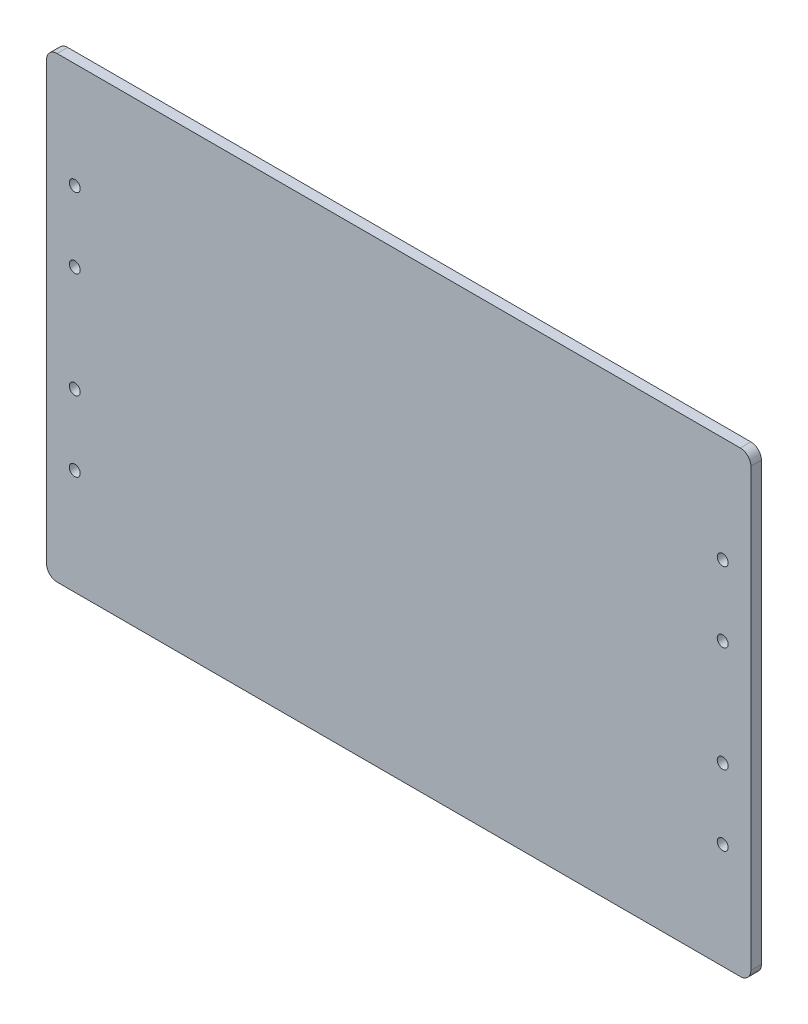
ISO-10303-21;
HEADER;
FILE_DESCRIPTION(('STEP AP214'),'2;1');
FILE_NAME('part.step','',(''),(''),'','','');
FILE_SCHEMA(('AUTOMOTIVE_DESIGN { 1 0 10303 214 1 1 1 1 }'));
ENDSEC;
DATA;
#1=APPLICATION_CONTEXT('core data for automotive mechanical design processes');
#2=APPLICATION_PROTOCOL_DEFINITION('international standard','automotive_design',2000,#1);
#3=PRODUCT_CONTEXT('',#1,'mechanical');
#4=PRODUCT('Part','Part','',(#3));
#5=PRODUCT_RELATED_PRODUCT_CATEGORY('part','',(#4));
#6=PRODUCT_DEFINITION_FORMATION('','',#4);
#7=PRODUCT_DEFINITION_CONTEXT('part definition',#1,'design');
#8=PRODUCT_DEFINITION('design','',#6,#7);
#9=PRODUCT_DEFINITION_SHAPE('','',#8);
#10=(LENGTH_UNIT() NAMED_UNIT(*) SI_UNIT(.MILLI.,.METRE.));
#11=(NAMED_UNIT(*) PLANE_ANGLE_UNIT() SI_UNIT($,.RADIAN.));
#12=(NAMED_UNIT(*) SI_UNIT($,.STERADIAN.) SOLID_ANGLE_UNIT());
#13=UNCERTAINTY_MEASURE_WITH_UNIT(LENGTH_MEASURE(1.E-05),#10,'distance_accuracy_value','');
#14=(GEOMETRIC_REPRESENTATION_CONTEXT(3) GLOBAL_UNCERTAINTY_ASSIGNED_CONTEXT((#13)) GLOBAL_UNIT_ASSIGNED_CONTEXT((#10,
#11,#12)) REPRESENTATION_CONTEXT('',''));
#15=CARTESIAN_POINT('',(0.,0.,0.));
#16=DIRECTION('',(0.,0.,1.));
#17=DIRECTION('',(1.,0.,0.));
#18=AXIS2_PLACEMENT_3D('',#15,#16,#17);
#19=CARTESIAN_POINT('',(100.,65.,3.));
#20=DIRECTION('',(-1.,0.,0.));
#21=DIRECTION('',(0.,-1.,0.));
#22=AXIS2_PLACEMENT_3D('',#19,#20,#21);
#23=PLANE('',#22);
#24=DIRECTION('',(0.,1.,0.));
#25=VECTOR('',#24,1.);
#26=CARTESIAN_POINT('',(100.,65.,3.));
#27=LINE('',#26,#25);
#28=CARTESIAN_POINT('',(100.,-62.,3.));
#29=VERTEX_POINT('',#28);
#30=CARTESIAN_POINT('',(100.,62.,3.));
#31=VERTEX_POINT('',#30);
#32=EDGE_CURVE('E127',#29,#31,#27,.T.);
#33=ORIENTED_EDGE('',*,*,#32,.F.);
#34=DIRECTION('',(0.,0.,-1.));
#35=VECTOR('',#34,1.);
#36=CARTESIAN_POINT('',(100.,-62.,3.));
#37=LINE('',#36,#35);
#38=CARTESIAN_POINT('',(100.,-62.,0.));
#39=VERTEX_POINT('',#38);
#40=EDGE_CURVE('E153',#29,#39,#37,.T.);
#41=ORIENTED_EDGE('',*,*,#40,.T.);
#42=DIRECTION('',(0.,1.,0.));
#43=VECTOR('',#42,1.);
#44=CARTESIAN_POINT('',(100.,65.,0.));
#45=LINE('',#44,#43);
#46=CARTESIAN_POINT('',(100.,62.,0.));
#47=VERTEX_POINT('',#46);
#48=EDGE_CURVE('E159',#39,#47,#45,.T.);
#49=ORIENTED_EDGE('',*,*,#48,.T.);
#50=DIRECTION('',(0.,0.,-1.));
#51=VECTOR('',#50,1.);
#52=CARTESIAN_POINT('',(100.,62.,3.));
#53=LINE('',#52,#51);
#54=EDGE_CURVE('E151',#47,#31,#53,.F.);
#55=ORIENTED_EDGE('',*,*,#54,.T.);
#56=EDGE_LOOP('',(#33,#41,#49,#55));
#57=FACE_BOUND('',#56,.T.);
#58=ADVANCED_FACE('F35',(#57),#23,.F.);
#59=CARTESIAN_POINT('',(-100.,65.,3.));
#60=DIRECTION('',(0.,-1.,0.));
#61=DIRECTION('',(0.,0.,-1.));
#62=AXIS2_PLACEMENT_3D('',#59,#60,#61);
#63=PLANE('',#62);
#64=DIRECTION('',(-1.,0.,0.));
#65=VECTOR('',#64,1.);
#66=CARTESIAN_POINT('',(-100.,65.,3.));
#67=LINE('',#66,#65);
#68=CARTESIAN_POINT('',(97.,65.,3.));
#69=VERTEX_POINT('',#68);
#70=CARTESIAN_POINT('',(-97.,65.,3.));
#71=VERTEX_POINT('',#70);
#72=EDGE_CURVE('E130',#69,#71,#67,.T.);
#73=ORIENTED_EDGE('',*,*,#72,.F.);
#74=DIRECTION('',(0.,0.,-1.));
#75=VECTOR('',#74,1.);
#76=CARTESIAN_POINT('',(97.,65.,3.));
#77=LINE('',#76,#75);
#78=CARTESIAN_POINT('',(97.,65.,0.));
#79=VERTEX_POINT('',#78);
#80=EDGE_CURVE('E11',#69,#79,#77,.T.);
#81=ORIENTED_EDGE('',*,*,#80,.T.);
#82=DIRECTION('',(-1.,0.,0.));
#83=VECTOR('',#82,1.);
#84=CARTESIAN_POINT('',(-100.,65.,0.));
#85=LINE('',#84,#83);
#86=CARTESIAN_POINT('',(-97.,65.,0.));
#87=VERTEX_POINT('',#86);
#88=EDGE_CURVE('E132',#79,#87,#85,.T.);
#89=ORIENTED_EDGE('',*,*,#88,.T.);
#90=DIRECTION('',(0.,0.,-1.));
#91=VECTOR('',#90,1.);
#92=CARTESIAN_POINT('',(-97.,65.,3.));
#93=LINE('',#92,#91);
#94=EDGE_CURVE('E43',#87,#71,#93,.F.);
#95=ORIENTED_EDGE('',*,*,#94,.T.);
#96=EDGE_LOOP('',(#73,#81,#89,#95));
#97=FACE_BOUND('',#96,.T.);
#98=ADVANCED_FACE('F257',(#97),#63,.F.);
#99=CARTESIAN_POINT('',(-100.,65.,3.));
#100=DIRECTION('',(1.,0.,0.));
#101=DIRECTION('',(0.,1.,0.));
#102=AXIS2_PLACEMENT_3D('',#99,#100,#101);
#103=PLANE('',#102);
#104=DIRECTION('',(0.,-1.,0.));
#105=VECTOR('',#104,1.);
#106=CARTESIAN_POINT('',(-100.,65.,0.));
#107=LINE('',#106,#105);
#108=CARTESIAN_POINT('',(-100.,62.,0.));
#109=VERTEX_POINT('',#108);
#110=CARTESIAN_POINT('',(-100.,-62.,0.));
#111=VERTEX_POINT('',#110);
#112=EDGE_CURVE('E128',#109,#111,#107,.T.);
#113=ORIENTED_EDGE('',*,*,#112,.T.);
#114=DIRECTION('',(0.,0.,-1.));
#115=VECTOR('',#114,1.);
#116=CARTESIAN_POINT('',(-100.,-62.,3.));
#117=LINE('',#116,#115);
#118=CARTESIAN_POINT('',(-100.,-62.,3.));
#119=VERTEX_POINT('',#118);
#120=EDGE_CURVE('E106',#111,#119,#117,.F.);
#121=ORIENTED_EDGE('',*,*,#120,.T.);
#122=DIRECTION('',(0.,-1.,0.));
#123=VECTOR('',#122,1.);
#124=CARTESIAN_POINT('',(-100.,65.,3.));
#125=LINE('',#124,#123);
#126=CARTESIAN_POINT('',(-100.,62.,3.));
#127=VERTEX_POINT('',#126);
#128=EDGE_CURVE('E171',#127,#119,#125,.T.);
#129=ORIENTED_EDGE('',*,*,#128,.F.);
#130=DIRECTION('',(0.,0.,-1.));
#131=VECTOR('',#130,1.);
#132=CARTESIAN_POINT('',(-100.,62.,3.));
#133=LINE('',#132,#131);
#134=EDGE_CURVE('E111',#127,#109,#133,.T.);
#135=ORIENTED_EDGE('',*,*,#134,.T.);
#136=EDGE_LOOP('',(#113,#121,#129,#135));
#137=FACE_BOUND('',#136,.T.);
#138=ADVANCED_FACE('F255',(#137),#103,.F.);
#139=CARTESIAN_POINT('',(-100.,-65.,3.));
#140=DIRECTION('',(0.,1.,0.));
#141=DIRECTION('',(0.,0.,1.));
#142=AXIS2_PLACEMENT_3D('',#139,#140,#141);
#143=PLANE('',#142);
#144=DIRECTION('',(1.,0.,0.));
#145=VECTOR('',#144,1.);
#146=CARTESIAN_POINT('',(-100.,-65.,3.));
#147=LINE('',#146,#145);
#148=CARTESIAN_POINT('',(-97.,-65.,3.));
#149=VERTEX_POINT('',#148);
#150=CARTESIAN_POINT('',(97.,-65.,3.));
#151=VERTEX_POINT('',#150);
#152=EDGE_CURVE('E121',#149,#151,#147,.T.);
#153=ORIENTED_EDGE('',*,*,#152,.F.);
#154=DIRECTION('',(0.,0.,-1.));
#155=VECTOR('',#154,1.);
#156=CARTESIAN_POINT('',(-97.,-65.,3.));
#157=LINE('',#156,#155);
#158=CARTESIAN_POINT('',(-97.,-65.,0.));
#159=VERTEX_POINT('',#158);
#160=EDGE_CURVE('E105',#149,#159,#157,.T.);
#161=ORIENTED_EDGE('',*,*,#160,.T.);
#162=DIRECTION('',(1.,0.,0.));
#163=VECTOR('',#162,1.);
#164=CARTESIAN_POINT('',(-100.,-65.,0.));
#165=LINE('',#164,#163);
#166=CARTESIAN_POINT('',(97.,-65.,0.));
#167=VERTEX_POINT('',#166);
#168=EDGE_CURVE('E118',#159,#167,#165,.T.);
#169=ORIENTED_EDGE('',*,*,#168,.T.);
#170=DIRECTION('',(0.,0.,-1.));
#171=VECTOR('',#170,1.);
#172=CARTESIAN_POINT('',(97.,-65.,3.));
#173=LINE('',#172,#171);
#174=EDGE_CURVE('E123',#167,#151,#173,.F.);
#175=ORIENTED_EDGE('',*,*,#174,.T.);
#176=EDGE_LOOP('',(#153,#161,#169,#175));
#177=FACE_BOUND('',#176,.T.);
#178=ADVANCED_FACE('F117',(#177),#143,.F.);
#179=CARTESIAN_POINT('',(0.,0.,3.));
#180=DIRECTION('',(0.,0.,1.));
#181=DIRECTION('',(1.,0.,0.));
#182=AXIS2_PLACEMENT_3D('',#179,#180,#181);
#183=PLANE('',#182);
#184=CARTESIAN_POINT('',(92.,35.,3.));
#185=DIRECTION('',(0.,0.,-1.));
#186=DIRECTION('',(-1.,0.,0.));
#187=AXIS2_PLACEMENT_3D('',#184,#185,#186);
#188=CIRCLE('',#187,1.54999999999999);
#189=CARTESIAN_POINT('',(90.45,35.,3.));
#190=VERTEX_POINT('',#189);
#191=EDGE_CURVE('E214',#190,#190,#188,.T.);
#192=ORIENTED_EDGE('',*,*,#191,.T.);
#193=EDGE_LOOP('',(#192));
#194=FACE_BOUND('',#193,.T.);
#195=CARTESIAN_POINT('',(92.,-15.,3.));
#196=DIRECTION('',(0.,0.,-1.));
#197=DIRECTION('',(1.,0.,0.));
#198=AXIS2_PLACEMENT_3D('',#195,#196,#197);
#199=CIRCLE('',#198,1.54999999999999);
#200=CARTESIAN_POINT('',(93.55,-15.,3.));
#201=VERTEX_POINT('',#200);
#202=EDGE_CURVE('E208',#201,#201,#199,.T.);
#203=ORIENTED_EDGE('',*,*,#202,.T.);
#204=EDGE_LOOP('',(#203));
#205=FACE_BOUND('',#204,.T.);
#206=CARTESIAN_POINT('',(92.,-35.,3.));
#207=DIRECTION('',(0.,0.,-1.));
#208=DIRECTION('',(1.,0.,0.));
#209=AXIS2_PLACEMENT_3D('',#206,#207,#208);
#210=CIRCLE('',#209,1.55000000000005);
#211=CARTESIAN_POINT('',(93.5500000000001,-35.,3.));
#212=VERTEX_POINT('',#211);
#213=EDGE_CURVE('E202',#212,#212,#210,.T.);
#214=ORIENTED_EDGE('',*,*,#213,.T.);
#215=EDGE_LOOP('',(#214));
#216=FACE_BOUND('',#215,.T.);
#217=CARTESIAN_POINT('',(92.,15.,3.));
#218=DIRECTION('',(0.,0.,-1.));
#219=DIRECTION('',(-1.,0.,0.));
#220=AXIS2_PLACEMENT_3D('',#217,#218,#219);
#221=CIRCLE('',#220,1.54999999999999);
#222=CARTESIAN_POINT('',(90.45,15.,3.));
#223=VERTEX_POINT('',#222);
#224=EDGE_CURVE('E196',#223,#223,#221,.T.);
#225=ORIENTED_EDGE('',*,*,#224,.T.);
#226=EDGE_LOOP('',(#225));
#227=FACE_BOUND('',#226,.T.);
#228=CARTESIAN_POINT('',(-92.,35.,3.));
#229=DIRECTION('',(0.,0.,1.));
#230=DIRECTION('',(1.,0.,0.));
#231=AXIS2_PLACEMENT_3D('',#228,#229,#230);
#232=CIRCLE('',#231,1.54999999999999);
#233=CARTESIAN_POINT('',(-90.45,35.,3.));
#234=VERTEX_POINT('',#233);
#235=EDGE_CURVE('E167',#234,#234,#232,.T.);
#236=ORIENTED_EDGE('',*,*,#235,.F.);
#237=EDGE_LOOP('',(#236));
#238=FACE_BOUND('',#237,.T.);
#239=CARTESIAN_POINT('',(-92.,-15.,3.));
#240=DIRECTION('',(0.,0.,1.));
#241=DIRECTION('',(-1.,0.,0.));
#242=AXIS2_PLACEMENT_3D('',#239,#240,#241);
#243=CIRCLE('',#242,1.54999999999999);
#244=CARTESIAN_POINT('',(-93.55,-15.,3.));
#245=VERTEX_POINT('',#244);
#246=EDGE_CURVE('E188',#245,#245,#243,.T.);
#247=ORIENTED_EDGE('',*,*,#246,.F.);
#248=EDGE_LOOP('',(#247));
#249=FACE_BOUND('',#248,.T.);
#250=CARTESIAN_POINT('',(-92.,-35.,3.));
#251=DIRECTION('',(0.,0.,1.));
#252=DIRECTION('',(-1.,0.,0.));
#253=AXIS2_PLACEMENT_3D('',#250,#251,#252);
#254=CIRCLE('',#253,1.55000000000005);
#255=CARTESIAN_POINT('',(-93.5500000000001,-35.,3.));
#256=VERTEX_POINT('',#255);
#257=EDGE_CURVE('E182',#256,#256,#254,.T.);
#258=ORIENTED_EDGE('',*,*,#257,.F.);
#259=EDGE_LOOP('',(#258));
#260=FACE_BOUND('',#259,.T.);
#261=CARTESIAN_POINT('',(-92.,15.,3.));
#262=DIRECTION('',(0.,0.,1.));
#263=DIRECTION('',(1.,0.,0.));
#264=AXIS2_PLACEMENT_3D('',#261,#262,#263);
#265=CIRCLE('',#264,1.54999999999999);
#266=CARTESIAN_POINT('',(-90.45,15.,3.));
#267=VERTEX_POINT('',#266);
#268=EDGE_CURVE('E175',#267,#267,#265,.T.);
#269=ORIENTED_EDGE('',*,*,#268,.F.);
#270=EDGE_LOOP('',(#269));
#271=FACE_BOUND('',#270,.T.);
#272=ORIENTED_EDGE('',*,*,#128,.T.);
#273=CARTESIAN_POINT('',(-97.,-62.,3.));
#274=DIRECTION('',(0.,0.,1.));
#275=DIRECTION('',(1.,0.,0.));
#276=AXIS2_PLACEMENT_3D('',#273,#274,#275);
#277=CIRCLE('',#276,3.);
#278=EDGE_CURVE('E149',#119,#149,#277,.T.);
#279=ORIENTED_EDGE('',*,*,#278,.T.);
#280=ORIENTED_EDGE('',*,*,#152,.T.);
#281=CARTESIAN_POINT('',(97.,-62.,3.));
#282=DIRECTION('',(0.,0.,1.));
#283=DIRECTION('',(1.,0.,0.));
#284=AXIS2_PLACEMENT_3D('',#281,#282,#283);
#285=CIRCLE('',#284,3.);
#286=EDGE_CURVE('E147',#151,#29,#285,.T.);
#287=ORIENTED_EDGE('',*,*,#286,.T.);
#288=ORIENTED_EDGE('',*,*,#32,.T.);
#289=CARTESIAN_POINT('',(97.,62.,3.));
#290=DIRECTION('',(0.,0.,1.));
#291=DIRECTION('',(1.,0.,0.));
#292=AXIS2_PLACEMENT_3D('',#289,#290,#291);
#293=CIRCLE('',#292,3.);
#294=EDGE_CURVE('E56',#31,#69,#293,.T.);
#295=ORIENTED_EDGE('',*,*,#294,.T.);
#296=ORIENTED_EDGE('',*,*,#72,.T.);
#297=CARTESIAN_POINT('',(-97.,62.,3.));
#298=DIRECTION('',(0.,0.,1.));
#299=DIRECTION('',(1.,0.,0.));
#300=AXIS2_PLACEMENT_3D('',#297,#298,#299);
#301=CIRCLE('',#300,3.);
#302=EDGE_CURVE('E144',#71,#127,#301,.T.);
#303=ORIENTED_EDGE('',*,*,#302,.T.);
#304=EDGE_LOOP('',(#272,#279,#280,#287,#288,#295,#296,#303));
#305=FACE_BOUND('',#304,.T.);
#306=ADVANCED_FACE('F226',(#194,#205,#216,#227,#238,#249,#260,#271,#305),#183,.T.);
#307=CARTESIAN_POINT('',(0.,0.,0.));
#308=DIRECTION('',(0.,0.,1.));
#309=DIRECTION('',(1.,0.,0.));
#310=AXIS2_PLACEMENT_3D('',#307,#308,#309);
#311=PLANE('',#310);
#312=CARTESIAN_POINT('',(92.,35.,0.));
#313=DIRECTION('',(0.,0.,-1.));
#314=DIRECTION('',(-1.,0.,0.));
#315=AXIS2_PLACEMENT_3D('',#312,#313,#314);
#316=CIRCLE('',#315,1.54999999999999);
#317=CARTESIAN_POINT('',(90.45,35.,0.));
#318=VERTEX_POINT('',#317);
#319=EDGE_CURVE('E179',#318,#318,#316,.T.);
#320=ORIENTED_EDGE('',*,*,#319,.F.);
#321=EDGE_LOOP('',(#320));
#322=FACE_BOUND('',#321,.T.);
#323=CARTESIAN_POINT('',(92.,-15.,0.));
#324=DIRECTION('',(0.,0.,-1.));
#325=DIRECTION('',(1.,0.,0.));
#326=AXIS2_PLACEMENT_3D('',#323,#324,#325);
#327=CIRCLE('',#326,1.54999999999999);
#328=CARTESIAN_POINT('',(93.55,-15.,0.));
#329=VERTEX_POINT('',#328);
#330=EDGE_CURVE('E211',#329,#329,#327,.T.);
#331=ORIENTED_EDGE('',*,*,#330,.F.);
#332=EDGE_LOOP('',(#331));
#333=FACE_BOUND('',#332,.T.);
#334=CARTESIAN_POINT('',(92.,-35.,0.));
#335=DIRECTION('',(0.,0.,-1.));
#336=DIRECTION('',(1.,0.,0.));
#337=AXIS2_PLACEMENT_3D('',#334,#335,#336);
#338=CIRCLE('',#337,1.55000000000005);
#339=CARTESIAN_POINT('',(93.5500000000001,-35.,0.));
#340=VERTEX_POINT('',#339);
#341=EDGE_CURVE('E205',#340,#340,#338,.T.);
#342=ORIENTED_EDGE('',*,*,#341,.F.);
#343=EDGE_LOOP('',(#342));
#344=FACE_BOUND('',#343,.T.);
#345=CARTESIAN_POINT('',(92.,15.,0.));
#346=DIRECTION('',(0.,0.,-1.));
#347=DIRECTION('',(-1.,0.,0.));
#348=AXIS2_PLACEMENT_3D('',#345,#346,#347);
#349=CIRCLE('',#348,1.54999999999999);
#350=CARTESIAN_POINT('',(90.45,15.,0.));
#351=VERTEX_POINT('',#350);
#352=EDGE_CURVE('E199',#351,#351,#349,.T.);
#353=ORIENTED_EDGE('',*,*,#352,.F.);
#354=EDGE_LOOP('',(#353));
#355=FACE_BOUND('',#354,.T.);
#356=CARTESIAN_POINT('',(-92.,35.,0.));
#357=DIRECTION('',(0.,0.,1.));
#358=DIRECTION('',(1.,0.,0.));
#359=AXIS2_PLACEMENT_3D('',#356,#357,#358);
#360=CIRCLE('',#359,1.54999999999999);
#361=CARTESIAN_POINT('',(-90.45,35.,0.));
#362=VERTEX_POINT('',#361);
#363=EDGE_CURVE('E164',#362,#362,#360,.T.);
#364=ORIENTED_EDGE('',*,*,#363,.T.);
#365=EDGE_LOOP('',(#364));
#366=FACE_BOUND('',#365,.T.);
#367=CARTESIAN_POINT('',(-92.,-15.,0.));
#368=DIRECTION('',(0.,0.,1.));
#369=DIRECTION('',(-1.,0.,0.));
#370=AXIS2_PLACEMENT_3D('',#367,#368,#369);
#371=CIRCLE('',#370,1.54999999999999);
#372=CARTESIAN_POINT('',(-93.55,-15.,0.));
#373=VERTEX_POINT('',#372);
#374=EDGE_CURVE('E191',#373,#373,#371,.T.);
#375=ORIENTED_EDGE('',*,*,#374,.T.);
#376=EDGE_LOOP('',(#375));
#377=FACE_BOUND('',#376,.T.);
#378=CARTESIAN_POINT('',(-92.,-35.,0.));
#379=DIRECTION('',(0.,0.,1.));
#380=DIRECTION('',(-1.,0.,0.));
#381=AXIS2_PLACEMENT_3D('',#378,#379,#380);
#382=CIRCLE('',#381,1.55000000000005);
#383=CARTESIAN_POINT('',(-93.5500000000001,-35.,0.));
#384=VERTEX_POINT('',#383);
#385=EDGE_CURVE('E185',#384,#384,#382,.T.);
#386=ORIENTED_EDGE('',*,*,#385,.T.);
#387=EDGE_LOOP('',(#386));
#388=FACE_BOUND('',#387,.T.);
#389=CARTESIAN_POINT('',(-92.,15.,0.));
#390=DIRECTION('',(0.,0.,1.));
#391=DIRECTION('',(1.,0.,0.));
#392=AXIS2_PLACEMENT_3D('',#389,#390,#391);
#393=CIRCLE('',#392,1.54999999999999);
#394=CARTESIAN_POINT('',(-90.45,15.,0.));
#395=VERTEX_POINT('',#394);
#396=EDGE_CURVE('E178',#395,#395,#393,.T.);
#397=ORIENTED_EDGE('',*,*,#396,.T.);
#398=EDGE_LOOP('',(#397));
#399=FACE_BOUND('',#398,.T.);
#400=ORIENTED_EDGE('',*,*,#168,.F.);
#401=CARTESIAN_POINT('',(-97.,-62.,0.));
#402=DIRECTION('',(0.,0.,1.));
#403=DIRECTION('',(1.,0.,0.));
#404=AXIS2_PLACEMENT_3D('',#401,#402,#403);
#405=CIRCLE('',#404,3.);
#406=EDGE_CURVE('E101',#159,#111,#405,.F.);
#407=ORIENTED_EDGE('',*,*,#406,.T.);
#408=ORIENTED_EDGE('',*,*,#112,.F.);
#409=CARTESIAN_POINT('',(-97.,62.,0.));
#410=DIRECTION('',(0.,0.,1.));
#411=DIRECTION('',(1.,0.,0.));
#412=AXIS2_PLACEMENT_3D('',#409,#410,#411);
#413=CIRCLE('',#412,3.);
#414=EDGE_CURVE('E122',#109,#87,#413,.F.);
#415=ORIENTED_EDGE('',*,*,#414,.T.);
#416=ORIENTED_EDGE('',*,*,#88,.F.);
#417=CARTESIAN_POINT('',(97.,62.,0.));
#418=DIRECTION('',(0.,0.,1.));
#419=DIRECTION('',(1.,0.,0.));
#420=AXIS2_PLACEMENT_3D('',#417,#418,#419);
#421=CIRCLE('',#420,3.);
#422=EDGE_CURVE('E138',#79,#47,#421,.F.);
#423=ORIENTED_EDGE('',*,*,#422,.T.);
#424=ORIENTED_EDGE('',*,*,#48,.F.);
#425=CARTESIAN_POINT('',(97.,-62.,0.));
#426=DIRECTION('',(0.,0.,1.));
#427=DIRECTION('',(1.,0.,0.));
#428=AXIS2_PLACEMENT_3D('',#425,#426,#427);
#429=CIRCLE('',#428,3.);
#430=EDGE_CURVE('E112',#39,#167,#429,.F.);
#431=ORIENTED_EDGE('',*,*,#430,.T.);
#432=EDGE_LOOP('',(#400,#407,#408,#415,#416,#423,#424,#431));
#433=FACE_BOUND('',#432,.T.);
#434=ADVANCED_FACE('F125',(#322,#333,#344,#355,#366,#377,#388,#399,#433),#311,.F.);
#435=CARTESIAN_POINT('',(-92.,15.,0.));
#436=DIRECTION('',(0.,0.,1.));
#437=DIRECTION('',(1.,0.,0.));
#438=AXIS2_PLACEMENT_3D('',#435,#436,#437);
#439=CYLINDRICAL_SURFACE('',#438,1.54999999999999);
#440=ORIENTED_EDGE('',*,*,#396,.F.);
#441=EDGE_LOOP('',(#440));
#442=FACE_BOUND('',#441,.T.);
#443=ORIENTED_EDGE('',*,*,#268,.T.);
#444=EDGE_LOOP('',(#443));
#445=FACE_BOUND('',#444,.T.);
#446=ADVANCED_FACE('F225',(#442,#445),#439,.F.);
#447=CARTESIAN_POINT('',(-92.,-35.,0.));
#448=DIRECTION('',(0.,0.,1.));
#449=DIRECTION('',(1.,0.,0.));
#450=AXIS2_PLACEMENT_3D('',#447,#448,#449);
#451=CYLINDRICAL_SURFACE('',#450,1.55000000000005);
#452=ORIENTED_EDGE('',*,*,#385,.F.);
#453=EDGE_LOOP('',(#452));
#454=FACE_BOUND('',#453,.T.);
#455=ORIENTED_EDGE('',*,*,#257,.T.);
#456=EDGE_LOOP('',(#455));
#457=FACE_BOUND('',#456,.T.);
#458=ADVANCED_FACE('F244',(#454,#457),#451,.F.);
#459=CARTESIAN_POINT('',(-92.,-15.,0.));
#460=DIRECTION('',(0.,0.,1.));
#461=DIRECTION('',(1.,0.,0.));
#462=AXIS2_PLACEMENT_3D('',#459,#460,#461);
#463=CYLINDRICAL_SURFACE('',#462,1.54999999999999);
#464=ORIENTED_EDGE('',*,*,#374,.F.);
#465=EDGE_LOOP('',(#464));
#466=FACE_BOUND('',#465,.T.);
#467=ORIENTED_EDGE('',*,*,#246,.T.);
#468=EDGE_LOOP('',(#467));
#469=FACE_BOUND('',#468,.T.);
#470=ADVANCED_FACE('F282',(#466,#469),#463,.F.);
#471=CARTESIAN_POINT('',(-92.,35.,0.));
#472=DIRECTION('',(0.,0.,1.));
#473=DIRECTION('',(1.,0.,0.));
#474=AXIS2_PLACEMENT_3D('',#471,#472,#473);
#475=CYLINDRICAL_SURFACE('',#474,1.54999999999999);
#476=ORIENTED_EDGE('',*,*,#363,.F.);
#477=EDGE_LOOP('',(#476));
#478=FACE_BOUND('',#477,.T.);
#479=ORIENTED_EDGE('',*,*,#235,.T.);
#480=EDGE_LOOP('',(#479));
#481=FACE_BOUND('',#480,.T.);
#482=ADVANCED_FACE('F286',(#478,#481),#475,.F.);
#483=CARTESIAN_POINT('',(92.,15.,0.));
#484=DIRECTION('',(0.,0.,1.));
#485=DIRECTION('',(1.,0.,0.));
#486=AXIS2_PLACEMENT_3D('',#483,#484,#485);
#487=CYLINDRICAL_SURFACE('',#486,1.54999999999999);
#488=ORIENTED_EDGE('',*,*,#352,.T.);
#489=EDGE_LOOP('',(#488));
#490=FACE_BOUND('',#489,.T.);
#491=ORIENTED_EDGE('',*,*,#224,.F.);
#492=EDGE_LOOP('',(#491));
#493=FACE_BOUND('',#492,.T.);
#494=ADVANCED_FACE('F290',(#490,#493),#487,.F.);
#495=CARTESIAN_POINT('',(92.,-35.,0.));
#496=DIRECTION('',(0.,0.,1.));
#497=DIRECTION('',(1.,0.,0.));
#498=AXIS2_PLACEMENT_3D('',#495,#496,#497);
#499=CYLINDRICAL_SURFACE('',#498,1.55000000000005);
#500=ORIENTED_EDGE('',*,*,#341,.T.);
#501=EDGE_LOOP('',(#500));
#502=FACE_BOUND('',#501,.T.);
#503=ORIENTED_EDGE('',*,*,#213,.F.);
#504=EDGE_LOOP('',(#503));
#505=FACE_BOUND('',#504,.T.);
#506=ADVANCED_FACE('F294',(#502,#505),#499,.F.);
#507=CARTESIAN_POINT('',(92.,-15.,0.));
#508=DIRECTION('',(0.,0.,1.));
#509=DIRECTION('',(1.,0.,0.));
#510=AXIS2_PLACEMENT_3D('',#507,#508,#509);
#511=CYLINDRICAL_SURFACE('',#510,1.54999999999999);
#512=ORIENTED_EDGE('',*,*,#330,.T.);
#513=EDGE_LOOP('',(#512));
#514=FACE_BOUND('',#513,.T.);
#515=ORIENTED_EDGE('',*,*,#202,.F.);
#516=EDGE_LOOP('',(#515));
#517=FACE_BOUND('',#516,.T.);
#518=ADVANCED_FACE('F298',(#514,#517),#511,.F.);
#519=CARTESIAN_POINT('',(92.,35.,0.));
#520=DIRECTION('',(0.,0.,1.));
#521=DIRECTION('',(1.,0.,0.));
#522=AXIS2_PLACEMENT_3D('',#519,#520,#521);
#523=CYLINDRICAL_SURFACE('',#522,1.54999999999999);
#524=ORIENTED_EDGE('',*,*,#319,.T.);
#525=EDGE_LOOP('',(#524));
#526=FACE_BOUND('',#525,.T.);
#527=ORIENTED_EDGE('',*,*,#191,.F.);
#528=EDGE_LOOP('',(#527));
#529=FACE_BOUND('',#528,.T.);
#530=ADVANCED_FACE('F220',(#526,#529),#523,.F.);
#531=CARTESIAN_POINT('',(-97.,-62.,3.));
#532=DIRECTION('',(0.,0.,-1.));
#533=DIRECTION('',(-1.,0.,0.));
#534=AXIS2_PLACEMENT_3D('',#531,#532,#533);
#535=CYLINDRICAL_SURFACE('',#534,3.);
#536=ORIENTED_EDGE('',*,*,#278,.F.);
#537=ORIENTED_EDGE('',*,*,#120,.F.);
#538=ORIENTED_EDGE('',*,*,#406,.F.);
#539=ORIENTED_EDGE('',*,*,#160,.F.);
#540=EDGE_LOOP('',(#536,#537,#538,#539));
#541=FACE_BOUND('',#540,.T.);
#542=ADVANCED_FACE('F104',(#541),#535,.T.);
#543=CARTESIAN_POINT('',(97.,-62.,3.));
#544=DIRECTION('',(0.,0.,-1.));
#545=DIRECTION('',(-1.,0.,0.));
#546=AXIS2_PLACEMENT_3D('',#543,#544,#545);
#547=CYLINDRICAL_SURFACE('',#546,3.);
#548=ORIENTED_EDGE('',*,*,#286,.F.);
#549=ORIENTED_EDGE('',*,*,#174,.F.);
#550=ORIENTED_EDGE('',*,*,#430,.F.);
#551=ORIENTED_EDGE('',*,*,#40,.F.);
#552=EDGE_LOOP('',(#548,#549,#550,#551));
#553=FACE_BOUND('',#552,.T.);
#554=ADVANCED_FACE('F261',(#553),#547,.T.);
#555=CARTESIAN_POINT('',(97.,62.,3.));
#556=DIRECTION('',(0.,0.,-1.));
#557=DIRECTION('',(-1.,0.,0.));
#558=AXIS2_PLACEMENT_3D('',#555,#556,#557);
#559=CYLINDRICAL_SURFACE('',#558,3.);
#560=ORIENTED_EDGE('',*,*,#294,.F.);
#561=ORIENTED_EDGE('',*,*,#54,.F.);
#562=ORIENTED_EDGE('',*,*,#422,.F.);
#563=ORIENTED_EDGE('',*,*,#80,.F.);
#564=EDGE_LOOP('',(#560,#561,#562,#563));
#565=FACE_BOUND('',#564,.T.);
#566=ADVANCED_FACE('F260',(#565),#559,.T.);
#567=CARTESIAN_POINT('',(-97.,62.,3.));
#568=DIRECTION('',(0.,0.,-1.));
#569=DIRECTION('',(-1.,0.,0.));
#570=AXIS2_PLACEMENT_3D('',#567,#568,#569);
#571=CYLINDRICAL_SURFACE('',#570,3.);
#572=ORIENTED_EDGE('',*,*,#302,.F.);
#573=ORIENTED_EDGE('',*,*,#94,.F.);
#574=ORIENTED_EDGE('',*,*,#414,.F.);
#575=ORIENTED_EDGE('',*,*,#134,.F.);
#576=EDGE_LOOP('',(#572,#573,#574,#575));
#577=FACE_BOUND('',#576,.T.);
#578=ADVANCED_FACE('F37',(#577),#571,.T.);
#579=CLOSED_SHELL('',(#58,#98,#138,#178,#306,#434,#446,#458,#470,#482,#494,#506,#518,#530,#542,
#554,#566,#578));
#580=MANIFOLD_SOLID_BREP('B2',#579);
#581=ADVANCED_BREP_SHAPE_REPRESENTATION('',(#18,#580),#14);
#582=SHAPE_DEFINITION_REPRESENTATION(#9,#581);
ENDSEC;
END-ISO-10303-21;
